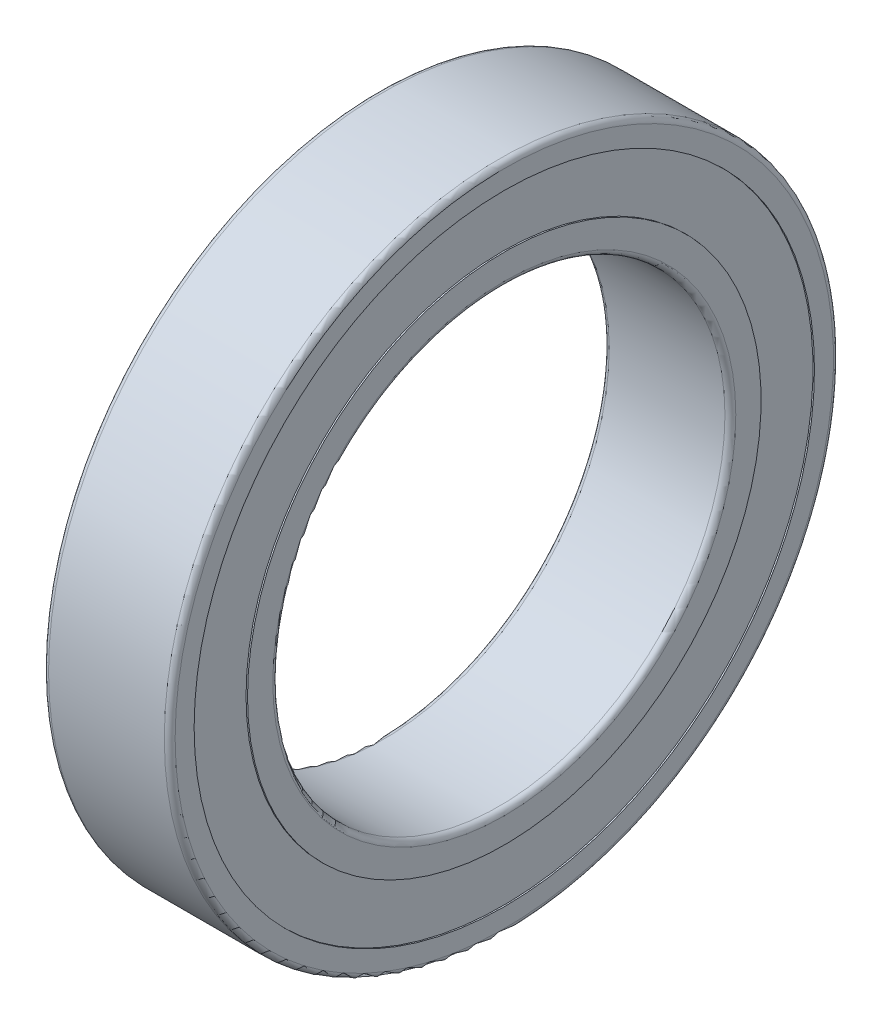
ISO-10303-21;
HEADER;
FILE_DESCRIPTION(('STEP AP214'),'2;1');
FILE_NAME('part.step','',(''),(''),'','','');
FILE_SCHEMA(('AUTOMOTIVE_DESIGN { 1 0 10303 214 1 1 1 1 }'));
ENDSEC;
DATA;
#1=APPLICATION_CONTEXT('core data for automotive mechanical design processes');
#2=APPLICATION_PROTOCOL_DEFINITION('international standard','automotive_design',2000,#1);
#3=PRODUCT_CONTEXT('',#1,'mechanical');
#4=PRODUCT('Part','Part','',(#3));
#5=PRODUCT_RELATED_PRODUCT_CATEGORY('part','',(#4));
#6=PRODUCT_DEFINITION_FORMATION('','',#4);
#7=PRODUCT_DEFINITION_CONTEXT('part definition',#1,'design');
#8=PRODUCT_DEFINITION('design','',#6,#7);
#9=PRODUCT_DEFINITION_SHAPE('','',#8);
#10=(LENGTH_UNIT() NAMED_UNIT(*) SI_UNIT(.MILLI.,.METRE.));
#11=(NAMED_UNIT(*) PLANE_ANGLE_UNIT() SI_UNIT($,.RADIAN.));
#12=(NAMED_UNIT(*) SI_UNIT($,.STERADIAN.) SOLID_ANGLE_UNIT());
#13=UNCERTAINTY_MEASURE_WITH_UNIT(LENGTH_MEASURE(1.E-05),#10,'distance_accuracy_value','');
#14=(GEOMETRIC_REPRESENTATION_CONTEXT(3) GLOBAL_UNCERTAINTY_ASSIGNED_CONTEXT((#13)) GLOBAL_UNIT_ASSIGNED_CONTEXT((#10,
#11,#12)) REPRESENTATION_CONTEXT('',''));
#15=CARTESIAN_POINT('',(0.,0.,0.));
#16=DIRECTION('',(0.,0.,1.));
#17=DIRECTION('',(1.,0.,0.));
#18=AXIS2_PLACEMENT_3D('',#15,#16,#17);
#19=CARTESIAN_POINT('',(0.,-14.4637840811476,-14.2));
#20=DIRECTION('',(-1.,0.,0.));
#21=DIRECTION('',(0.,0.,1.));
#22=AXIS2_PLACEMENT_3D('',#19,#20,#21);
#23=PLANE('',#22);
#24=CARTESIAN_POINT('',(0.,0.,0.));
#25=DIRECTION('',(-1.,0.,0.));
#26=DIRECTION('',(0.,0.,-1.));
#27=AXIS2_PLACEMENT_3D('',#24,#25,#26);
#28=CIRCLE('',#27,14.2);
#29=CARTESIAN_POINT('',(0.,0.,-14.2));
#30=VERTEX_POINT('',#29);
#31=EDGE_CURVE('E67',#30,#30,#28,.F.);
#32=ORIENTED_EDGE('',*,*,#31,.F.);
#33=EDGE_LOOP('',(#32));
#34=FACE_BOUND('',#33,.T.);
#35=CARTESIAN_POINT('',(0.,0.,0.));
#36=DIRECTION('',(1.,0.,0.));
#37=DIRECTION('',(0.,0.,1.));
#38=AXIS2_PLACEMENT_3D('',#35,#36,#37);
#39=CIRCLE('',#38,12.8);
#40=CARTESIAN_POINT('',(0.,0.,12.8));
#41=VERTEX_POINT('',#40);
#42=EDGE_CURVE('E64',#41,#41,#39,.T.);
#43=ORIENTED_EDGE('',*,*,#42,.T.);
#44=EDGE_LOOP('',(#43));
#45=FACE_BOUND('',#44,.T.);
#46=ADVANCED_FACE('F14',(#34,#45),#23,.T.);
#47=CARTESIAN_POINT('',(7.,-14.4637840811476,14.2));
#48=DIRECTION('',(1.,0.,0.));
#49=DIRECTION('',(0.,0.,-1.));
#50=AXIS2_PLACEMENT_3D('',#47,#48,#49);
#51=PLANE('',#50);
#52=CARTESIAN_POINT('',(7.,0.,0.));
#53=DIRECTION('',(1.,0.,0.));
#54=DIRECTION('',(0.,0.,1.));
#55=AXIS2_PLACEMENT_3D('',#52,#53,#54);
#56=CIRCLE('',#55,14.2);
#57=CARTESIAN_POINT('',(7.,0.,14.2));
#58=VERTEX_POINT('',#57);
#59=EDGE_CURVE('E61',#58,#58,#56,.T.);
#60=ORIENTED_EDGE('',*,*,#59,.T.);
#61=EDGE_LOOP('',(#60));
#62=FACE_BOUND('',#61,.T.);
#63=CARTESIAN_POINT('',(7.,0.,0.));
#64=DIRECTION('',(-1.,0.,0.));
#65=DIRECTION('',(0.,0.,-1.));
#66=AXIS2_PLACEMENT_3D('',#63,#64,#65);
#67=CIRCLE('',#66,12.8000000587981);
#68=CARTESIAN_POINT('',(7.,0.,-12.8000000587981));
#69=VERTEX_POINT('',#68);
#70=EDGE_CURVE('E58',#69,#69,#67,.F.);
#71=ORIENTED_EDGE('',*,*,#70,.F.);
#72=EDGE_LOOP('',(#71));
#73=FACE_BOUND('',#72,.T.);
#74=ADVANCED_FACE('F75',(#62,#73),#51,.T.);
#75=CARTESIAN_POINT('',(6.9195,-17.4685842951888,17.15));
#76=DIRECTION('',(1.,0.,0.));
#77=DIRECTION('',(0.,0.,-1.));
#78=AXIS2_PLACEMENT_3D('',#75,#76,#77);
#79=PLANE('',#78);
#80=CARTESIAN_POINT('',(6.9195,0.,0.));
#81=DIRECTION('',(1.,0.,0.));
#82=DIRECTION('',(0.,0.,1.));
#83=AXIS2_PLACEMENT_3D('',#80,#81,#82);
#84=CIRCLE('',#83,17.15);
#85=CARTESIAN_POINT('',(6.9195,0.,17.15));
#86=VERTEX_POINT('',#85);
#87=EDGE_CURVE('E55',#86,#86,#84,.T.);
#88=ORIENTED_EDGE('',*,*,#87,.T.);
#89=EDGE_LOOP('',(#88));
#90=FACE_BOUND('',#89,.T.);
#91=CARTESIAN_POINT('',(6.9195,0.,0.));
#92=DIRECTION('',(-1.,0.,0.));
#93=DIRECTION('',(0.,0.,-1.));
#94=AXIS2_PLACEMENT_3D('',#91,#92,#93);
#95=CIRCLE('',#94,14.2);
#96=CARTESIAN_POINT('',(6.9195,0.,-14.2));
#97=VERTEX_POINT('',#96);
#98=EDGE_CURVE('E52',#97,#97,#95,.F.);
#99=ORIENTED_EDGE('',*,*,#98,.F.);
#100=EDGE_LOOP('',(#99));
#101=FACE_BOUND('',#100,.T.);
#102=ADVANCED_FACE('F134',(#90,#101),#79,.T.);
#103=CARTESIAN_POINT('',(7.,-18.5380894244593,18.2));
#104=DIRECTION('',(1.,0.,0.));
#105=DIRECTION('',(0.,0.,-1.));
#106=AXIS2_PLACEMENT_3D('',#103,#104,#105);
#107=PLANE('',#106);
#108=CARTESIAN_POINT('',(7.,0.,0.));
#109=DIRECTION('',(1.,0.,0.));
#110=DIRECTION('',(0.,-1.16832863286218E-09,1.));
#111=AXIS2_PLACEMENT_3D('',#108,#109,#110);
#112=CIRCLE('',#111,18.2000000077429);
#113=CARTESIAN_POINT('',(7.,-2.12635811271379E-08,18.2000000077429));
#114=VERTEX_POINT('',#113);
#115=EDGE_CURVE('E49',#114,#114,#112,.T.);
#116=ORIENTED_EDGE('',*,*,#115,.T.);
#117=EDGE_LOOP('',(#116));
#118=FACE_BOUND('',#117,.T.);
#119=CARTESIAN_POINT('',(7.,0.,0.));
#120=DIRECTION('',(-1.,0.,0.));
#121=DIRECTION('',(0.,0.,-1.));
#122=AXIS2_PLACEMENT_3D('',#119,#120,#121);
#123=CIRCLE('',#122,17.15);
#124=CARTESIAN_POINT('',(7.,0.,-17.15));
#125=VERTEX_POINT('',#124);
#126=EDGE_CURVE('E46',#125,#125,#123,.F.);
#127=ORIENTED_EDGE('',*,*,#126,.F.);
#128=EDGE_LOOP('',(#127));
#129=FACE_BOUND('',#128,.T.);
#130=ADVANCED_FACE('F129',(#118,#129),#107,.T.);
#131=CARTESIAN_POINT('',(0.,-18.5380894561187,-18.2));
#132=DIRECTION('',(-1.,0.,0.));
#133=DIRECTION('',(0.,0.,1.));
#134=AXIS2_PLACEMENT_3D('',#131,#132,#133);
#135=PLANE('',#134);
#136=CARTESIAN_POINT('',(0.,0.,0.));
#137=DIRECTION('',(-1.,0.,0.));
#138=DIRECTION('',(0.,0.,-1.));
#139=AXIS2_PLACEMENT_3D('',#136,#137,#138);
#140=CIRCLE('',#139,18.2000000184317);
#141=CARTESIAN_POINT('',(0.,0.,-18.2000000184317));
#142=VERTEX_POINT('',#141);
#143=EDGE_CURVE('E43',#142,#142,#140,.F.);
#144=ORIENTED_EDGE('',*,*,#143,.F.);
#145=EDGE_LOOP('',(#144));
#146=FACE_BOUND('',#145,.T.);
#147=CARTESIAN_POINT('',(0.,0.,0.));
#148=DIRECTION('',(1.,0.,0.));
#149=DIRECTION('',(0.,0.,1.));
#150=AXIS2_PLACEMENT_3D('',#147,#148,#149);
#151=CIRCLE('',#150,17.15);
#152=CARTESIAN_POINT('',(0.,0.,17.15));
#153=VERTEX_POINT('',#152);
#154=EDGE_CURVE('E40',#153,#153,#151,.T.);
#155=ORIENTED_EDGE('',*,*,#154,.T.);
#156=EDGE_LOOP('',(#155));
#157=FACE_BOUND('',#156,.T.);
#158=ADVANCED_FACE('F93',(#146,#157),#135,.T.);
#159=CARTESIAN_POINT('',(0.0805,-17.4685842850957,-17.15));
#160=DIRECTION('',(-1.,0.,0.));
#161=DIRECTION('',(0.,0.,1.));
#162=AXIS2_PLACEMENT_3D('',#159,#160,#161);
#163=PLANE('',#162);
#164=CARTESIAN_POINT('',(0.0805,0.,0.));
#165=DIRECTION('',(-1.,0.,0.));
#166=DIRECTION('',(0.,0.,-1.));
#167=AXIS2_PLACEMENT_3D('',#164,#165,#166);
#168=CIRCLE('',#167,17.15);
#169=CARTESIAN_POINT('',(0.0805,0.,-17.15));
#170=VERTEX_POINT('',#169);
#171=EDGE_CURVE('E37',#170,#170,#168,.F.);
#172=ORIENTED_EDGE('',*,*,#171,.F.);
#173=EDGE_LOOP('',(#172));
#174=FACE_BOUND('',#173,.T.);
#175=CARTESIAN_POINT('',(0.0805,0.,0.));
#176=DIRECTION('',(1.,0.,0.));
#177=DIRECTION('',(0.,0.,1.));
#178=AXIS2_PLACEMENT_3D('',#175,#176,#177);
#179=CIRCLE('',#178,14.2);
#180=CARTESIAN_POINT('',(0.0805,0.,14.2));
#181=VERTEX_POINT('',#180);
#182=EDGE_CURVE('E34',#181,#181,#179,.T.);
#183=ORIENTED_EDGE('',*,*,#182,.T.);
#184=EDGE_LOOP('',(#183));
#185=FACE_BOUND('',#184,.T.);
#186=ADVANCED_FACE('F82',(#174,#185),#163,.T.);
#187=CARTESIAN_POINT('',(0.299999999999936,0.,0.));
#188=DIRECTION('',(1.,0.,0.));
#189=DIRECTION('',(0.,0.,1.));
#190=AXIS2_PLACEMENT_3D('',#187,#188,#189);
#191=TOROIDAL_SURFACE('',#190,12.8,0.299999999999936);
#192=CARTESIAN_POINT('',(0.3,0.,0.));
#193=DIRECTION('',(1.,0.,0.));
#194=DIRECTION('',(0.,0.,1.));
#195=AXIS2_PLACEMENT_3D('',#192,#193,#194);
#196=CIRCLE('',#195,12.5000000000001);
#197=CARTESIAN_POINT('',(0.3,0.,12.5000000000001));
#198=VERTEX_POINT('',#197);
#199=EDGE_CURVE('E29',#198,#198,#196,.T.);
#200=ORIENTED_EDGE('',*,*,#199,.T.);
#201=EDGE_LOOP('',(#200));
#202=FACE_BOUND('',#201,.T.);
#203=ORIENTED_EDGE('',*,*,#42,.F.);
#204=EDGE_LOOP('',(#203));
#205=FACE_BOUND('',#204,.T.);
#206=ADVANCED_FACE('F79',(#202,#205),#191,.T.);
#207=CARTESIAN_POINT('',(7.,0.,0.));
#208=DIRECTION('',(1.,0.,0.));
#209=DIRECTION('',(0.,0.,1.));
#210=AXIS2_PLACEMENT_3D('',#207,#208,#209);
#211=CYLINDRICAL_SURFACE('',#210,12.5);
#212=CARTESIAN_POINT('',(6.7,0.,0.));
#213=DIRECTION('',(1.,0.,0.));
#214=DIRECTION('',(0.,0.,1.));
#215=AXIS2_PLACEMENT_3D('',#212,#213,#214);
#216=CIRCLE('',#215,12.5);
#217=CARTESIAN_POINT('',(6.7,0.,12.5));
#218=VERTEX_POINT('',#217);
#219=EDGE_CURVE('E25',#218,#218,#216,.T.);
#220=ORIENTED_EDGE('',*,*,#219,.T.);
#221=EDGE_LOOP('',(#220));
#222=FACE_BOUND('',#221,.T.);
#223=ORIENTED_EDGE('',*,*,#199,.F.);
#224=EDGE_LOOP('',(#223));
#225=FACE_BOUND('',#224,.T.);
#226=ADVANCED_FACE('F81',(#222,#225),#211,.F.);
#227=CARTESIAN_POINT('',(6.70000000000013,0.,0.));
#228=DIRECTION('',(1.,0.,0.));
#229=DIRECTION('',(0.,0.,1.));
#230=AXIS2_PLACEMENT_3D('',#227,#228,#229);
#231=TOROIDAL_SURFACE('',#230,12.7999999999999,0.299999999999875);
#232=ORIENTED_EDGE('',*,*,#70,.T.);
#233=EDGE_LOOP('',(#232));
#234=FACE_BOUND('',#233,.T.);
#235=ORIENTED_EDGE('',*,*,#219,.F.);
#236=EDGE_LOOP('',(#235));
#237=FACE_BOUND('',#236,.T.);
#238=ADVANCED_FACE('F90',(#234,#237),#231,.T.);
#239=CARTESIAN_POINT('',(7.,0.,0.));
#240=DIRECTION('',(1.,0.,0.));
#241=DIRECTION('',(0.,0.,1.));
#242=AXIS2_PLACEMENT_3D('',#239,#240,#241);
#243=CYLINDRICAL_SURFACE('',#242,14.2);
#244=ORIENTED_EDGE('',*,*,#98,.T.);
#245=EDGE_LOOP('',(#244));
#246=FACE_BOUND('',#245,.T.);
#247=ORIENTED_EDGE('',*,*,#59,.F.);
#248=EDGE_LOOP('',(#247));
#249=FACE_BOUND('',#248,.T.);
#250=ADVANCED_FACE('F100',(#246,#249),#243,.T.);
#251=CARTESIAN_POINT('',(7.,0.,0.));
#252=DIRECTION('',(1.,0.,0.));
#253=DIRECTION('',(0.,1.16838773134995E-09,1.));
#254=AXIS2_PLACEMENT_3D('',#251,#252,#253);
#255=CYLINDRICAL_SURFACE('',#254,17.15);
#256=ORIENTED_EDGE('',*,*,#126,.T.);
#257=EDGE_LOOP('',(#256));
#258=FACE_BOUND('',#257,.T.);
#259=ORIENTED_EDGE('',*,*,#87,.F.);
#260=EDGE_LOOP('',(#259));
#261=FACE_BOUND('',#260,.T.);
#262=ADVANCED_FACE('F104',(#258,#261),#255,.F.);
#263=CARTESIAN_POINT('',(6.70000000000012,0.,0.));
#264=DIRECTION('',(1.,0.,0.));
#265=DIRECTION('',(0.,0.,1.));
#266=AXIS2_PLACEMENT_3D('',#263,#264,#265);
#267=TOROIDAL_SURFACE('',#266,18.2,0.29999999999988);
#268=CARTESIAN_POINT('',(6.70000000000012,0.,0.));
#269=DIRECTION('',(1.,0.,0.));
#270=DIRECTION('',(0.,0.,1.));
#271=AXIS2_PLACEMENT_3D('',#268,#269,#270);
#272=CIRCLE('',#271,18.4999999999999);
#273=CARTESIAN_POINT('',(6.70000000000012,0.,18.4999999999999));
#274=VERTEX_POINT('',#273);
#275=EDGE_CURVE('E21',#274,#274,#272,.T.);
#276=ORIENTED_EDGE('',*,*,#275,.T.);
#277=EDGE_LOOP('',(#276));
#278=FACE_BOUND('',#277,.T.);
#279=ORIENTED_EDGE('',*,*,#115,.F.);
#280=EDGE_LOOP('',(#279));
#281=FACE_BOUND('',#280,.T.);
#282=ADVANCED_FACE('F108',(#278,#281),#267,.T.);
#283=CARTESIAN_POINT('',(7.,0.,0.));
#284=DIRECTION('',(1.,0.,0.));
#285=DIRECTION('',(0.,0.,1.));
#286=AXIS2_PLACEMENT_3D('',#283,#284,#285);
#287=CYLINDRICAL_SURFACE('',#286,18.5);
#288=CARTESIAN_POINT('',(0.3,0.,0.));
#289=DIRECTION('',(1.,0.,0.));
#290=DIRECTION('',(0.,0.,1.));
#291=AXIS2_PLACEMENT_3D('',#288,#289,#290);
#292=CIRCLE('',#291,18.5);
#293=CARTESIAN_POINT('',(0.3,0.,18.5));
#294=VERTEX_POINT('',#293);
#295=EDGE_CURVE('E9',#294,#294,#292,.T.);
#296=ORIENTED_EDGE('',*,*,#295,.T.);
#297=EDGE_LOOP('',(#296));
#298=FACE_BOUND('',#297,.T.);
#299=ORIENTED_EDGE('',*,*,#275,.F.);
#300=EDGE_LOOP('',(#299));
#301=FACE_BOUND('',#300,.T.);
#302=ADVANCED_FACE('F112',(#298,#301),#287,.T.);
#303=CARTESIAN_POINT('',(0.299999999999941,0.,0.));
#304=DIRECTION('',(1.,0.,0.));
#305=DIRECTION('',(0.,0.,1.));
#306=AXIS2_PLACEMENT_3D('',#303,#304,#305);
#307=TOROIDAL_SURFACE('',#306,18.2,0.299999999999943);
#308=ORIENTED_EDGE('',*,*,#143,.T.);
#309=EDGE_LOOP('',(#308));
#310=FACE_BOUND('',#309,.T.);
#311=ORIENTED_EDGE('',*,*,#295,.F.);
#312=EDGE_LOOP('',(#311));
#313=FACE_BOUND('',#312,.T.);
#314=ADVANCED_FACE('F115',(#310,#313),#307,.T.);
#315=CARTESIAN_POINT('',(7.,0.,0.));
#316=DIRECTION('',(1.,0.,0.));
#317=DIRECTION('',(0.,1.16838773134995E-09,1.));
#318=AXIS2_PLACEMENT_3D('',#315,#316,#317);
#319=CYLINDRICAL_SURFACE('',#318,17.15);
#320=ORIENTED_EDGE('',*,*,#171,.T.);
#321=EDGE_LOOP('',(#320));
#322=FACE_BOUND('',#321,.T.);
#323=ORIENTED_EDGE('',*,*,#154,.F.);
#324=EDGE_LOOP('',(#323));
#325=FACE_BOUND('',#324,.T.);
#326=ADVANCED_FACE('F117',(#322,#325),#319,.F.);
#327=CARTESIAN_POINT('',(7.,0.,0.));
#328=DIRECTION('',(1.,0.,0.));
#329=DIRECTION('',(0.,0.,1.));
#330=AXIS2_PLACEMENT_3D('',#327,#328,#329);
#331=CYLINDRICAL_SURFACE('',#330,14.2);
#332=ORIENTED_EDGE('',*,*,#31,.T.);
#333=EDGE_LOOP('',(#332));
#334=FACE_BOUND('',#333,.T.);
#335=ORIENTED_EDGE('',*,*,#182,.F.);
#336=EDGE_LOOP('',(#335));
#337=FACE_BOUND('',#336,.T.);
#338=ADVANCED_FACE('F16',(#334,#337),#331,.T.);
#339=CLOSED_SHELL('',(#46,#74,#102,#130,#158,#186,#206,#226,#238,#250,#262,#282,#302,#314,#326,#338));
#340=MANIFOLD_SOLID_BREP('B1',#339);
#341=ADVANCED_BREP_SHAPE_REPRESENTATION('',(#18,#340),#14);
#342=SHAPE_DEFINITION_REPRESENTATION(#9,#341);
ENDSEC;
END-ISO-10303-21;
